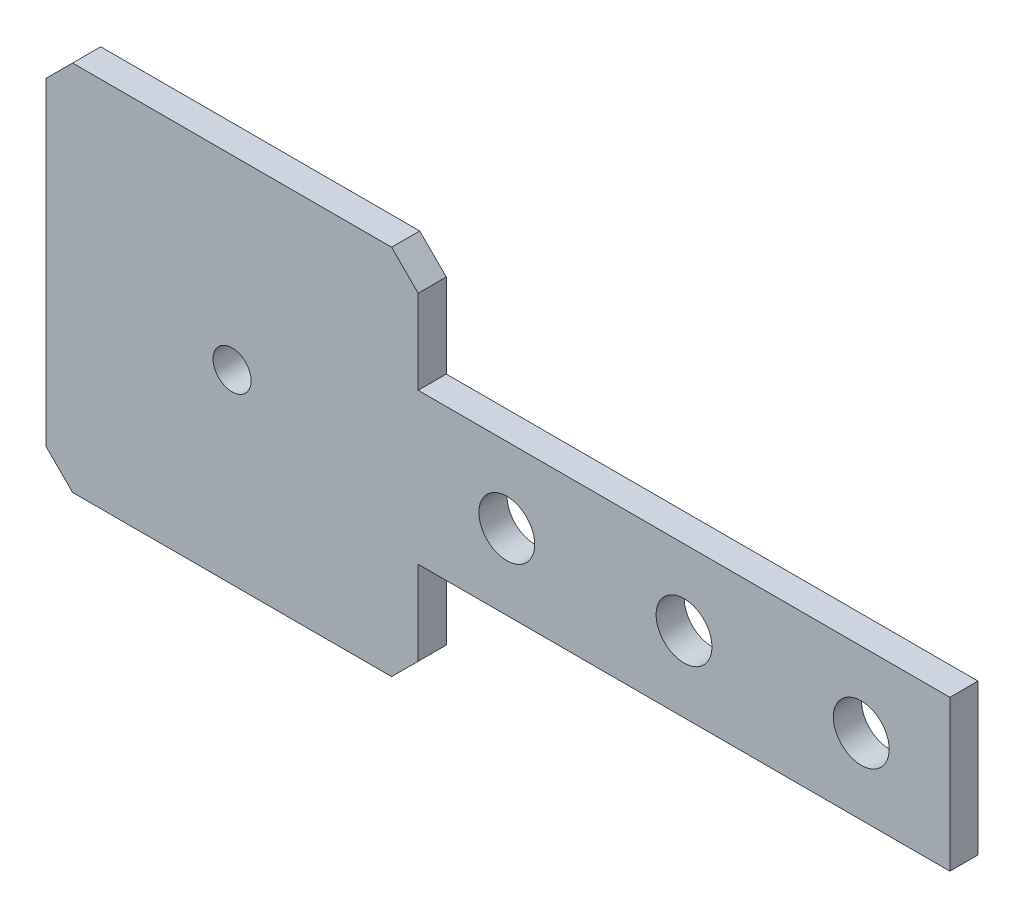
ISO-10303-21;
HEADER;
FILE_DESCRIPTION(('STEP AP214'),'2;1');
FILE_NAME('part.step','',(''),(''),'','','');
FILE_SCHEMA(('AUTOMOTIVE_DESIGN { 1 0 10303 214 1 1 1 1 }'));
ENDSEC;
DATA;
#1=APPLICATION_CONTEXT('core data for automotive mechanical design processes');
#2=APPLICATION_PROTOCOL_DEFINITION('international standard','automotive_design',2000,#1);
#3=PRODUCT_CONTEXT('',#1,'mechanical');
#4=PRODUCT('Part','Part','',(#3));
#5=PRODUCT_RELATED_PRODUCT_CATEGORY('part','',(#4));
#6=PRODUCT_DEFINITION_FORMATION('','',#4);
#7=PRODUCT_DEFINITION_CONTEXT('part definition',#1,'design');
#8=PRODUCT_DEFINITION('design','',#6,#7);
#9=PRODUCT_DEFINITION_SHAPE('','',#8);
#10=(LENGTH_UNIT() NAMED_UNIT(*) SI_UNIT(.MILLI.,.METRE.));
#11=(NAMED_UNIT(*) PLANE_ANGLE_UNIT() SI_UNIT($,.RADIAN.));
#12=(NAMED_UNIT(*) SI_UNIT($,.STERADIAN.) SOLID_ANGLE_UNIT());
#13=UNCERTAINTY_MEASURE_WITH_UNIT(LENGTH_MEASURE(1.E-05),#10,'distance_accuracy_value','');
#14=(GEOMETRIC_REPRESENTATION_CONTEXT(3) GLOBAL_UNCERTAINTY_ASSIGNED_CONTEXT((#13)) GLOBAL_UNIT_ASSIGNED_CONTEXT((#10,
#11,#12)) REPRESENTATION_CONTEXT('',''));
#15=CARTESIAN_POINT('',(0.,0.,0.));
#16=DIRECTION('',(0.,0.,1.));
#17=DIRECTION('',(1.,0.,0.));
#18=AXIS2_PLACEMENT_3D('',#15,#16,#17);
#19=CARTESIAN_POINT('',(0.,0.,3.17500000000004));
#20=DIRECTION('',(0.,0.,1.));
#21=DIRECTION('',(0.999999999999999,0.,0.));
#22=AXIS2_PLACEMENT_3D('',#19,#20,#21);
#23=PLANE('',#22);
#24=CARTESIAN_POINT('',(-80.0695335083055,-33.0925557638442,3.17500000000004));
#25=DIRECTION('',(0.,0.,1.));
#26=DIRECTION('',(0.999999999999999,0.,0.));
#27=AXIS2_PLACEMENT_3D('',#24,#25,#26);
#28=CIRCLE('',#27,3.15);
#29=CARTESIAN_POINT('',(-76.9195335083055,-33.0925557638442,3.17500000000004));
#30=VERTEX_POINT('',#29);
#31=EDGE_CURVE('E343',#30,#30,#28,.T.);
#32=ORIENTED_EDGE('',*,*,#31,.F.);
#33=EDGE_LOOP('',(#32));
#34=FACE_BOUND('',#33,.T.);
#35=CARTESIAN_POINT('',(-111.069533508305,-33.0925557638438,3.17500000000004));
#36=DIRECTION('',(0.,0.,1.));
#37=DIRECTION('',(0.999999999999999,0.,0.));
#38=AXIS2_PLACEMENT_3D('',#35,#36,#37);
#39=CIRCLE('',#38,2.15);
#40=CARTESIAN_POINT('',(-108.919533508305,-33.0925557638438,3.17500000000004));
#41=VERTEX_POINT('',#40);
#42=EDGE_CURVE('E173',#41,#41,#39,.T.);
#43=ORIENTED_EDGE('',*,*,#42,.F.);
#44=EDGE_LOOP('',(#43));
#45=FACE_BOUND('',#44,.T.);
#46=DIRECTION('',(0.707106781186554,0.707106781186541,0.));
#47=VECTOR('',#46,1.);
#48=CARTESIAN_POINT('',(-93.0695335083056,-54.0770792256711,3.17499999999993));
#49=LINE('',#48,#47);
#50=CARTESIAN_POINT('',(-93.0695335083056,-54.0770792256711,3.17499999999993));
#51=VERTEX_POINT('',#50);
#52=CARTESIAN_POINT('',(-90.0695335083055,-51.0770792256709,3.17499999999993));
#53=VERTEX_POINT('',#52);
#54=EDGE_CURVE('E203',#51,#53,#49,.T.);
#55=ORIENTED_EDGE('',*,*,#54,.T.);
#56=DIRECTION('',(0.,1.,0.));
#57=VECTOR('',#56,1.);
#58=CARTESIAN_POINT('',(-90.0695335083055,-51.0770792256709,3.17499999999993));
#59=LINE('',#58,#57);
#60=CARTESIAN_POINT('',(-90.0695335083055,-41.5925557638441,3.17500000000004));
#61=VERTEX_POINT('',#60);
#62=EDGE_CURVE('E114',#53,#61,#59,.T.);
#63=ORIENTED_EDGE('',*,*,#62,.T.);
#64=DIRECTION('',(0.999999999999999,0.,0.));
#65=VECTOR('',#64,1.);
#66=CARTESIAN_POINT('',(-90.0695335083055,-41.5925557638441,3.17500000000004));
#67=LINE('',#66,#65);
#68=CARTESIAN_POINT('',(-30.0695335083057,-41.5925557638441,3.17500000000004));
#69=VERTEX_POINT('',#68);
#70=EDGE_CURVE('E241',#61,#69,#67,.T.);
#71=ORIENTED_EDGE('',*,*,#70,.T.);
#72=DIRECTION('',(0.,1.,0.));
#73=VECTOR('',#72,1.);
#74=CARTESIAN_POINT('',(-30.0695335083057,-41.5925557638441,3.17500000000004));
#75=LINE('',#74,#73);
#76=CARTESIAN_POINT('',(-30.0695335083054,-24.5925557638442,3.17499999999915));
#77=VERTEX_POINT('',#76);
#78=EDGE_CURVE('E261',#69,#77,#75,.T.);
#79=ORIENTED_EDGE('',*,*,#78,.T.);
#80=DIRECTION('',(-0.999999999999999,0.,0.));
#81=VECTOR('',#80,1.);
#82=CARTESIAN_POINT('',(-30.0695335083054,-24.5925557638442,3.17499999999915));
#83=LINE('',#82,#81);
#84=CARTESIAN_POINT('',(-90.0695335083055,-24.5925557638442,3.17499999999915));
#85=VERTEX_POINT('',#84);
#86=EDGE_CURVE('E257',#77,#85,#83,.T.);
#87=ORIENTED_EDGE('',*,*,#86,.T.);
#88=DIRECTION('',(0.,1.,0.));
#89=VECTOR('',#88,1.);
#90=CARTESIAN_POINT('',(-90.0695335083055,-24.5925557638442,3.17499999999915));
#91=LINE('',#90,#89);
#92=CARTESIAN_POINT('',(-90.0695335083048,-15.1080323020174,3.17499999999993));
#93=VERTEX_POINT('',#92);
#94=EDGE_CURVE('E260',#85,#93,#91,.T.);
#95=ORIENTED_EDGE('',*,*,#94,.T.);
#96=DIRECTION('',(-0.707106781186548,0.707106781186547,0.));
#97=VECTOR('',#96,1.);
#98=CARTESIAN_POINT('',(-90.0695335083048,-15.1080323020174,3.17499999999993));
#99=LINE('',#98,#97);
#100=CARTESIAN_POINT('',(-93.0695335083049,-12.1080323020173,3.17499999999993));
#101=VERTEX_POINT('',#100);
#102=EDGE_CURVE('E266',#93,#101,#99,.T.);
#103=ORIENTED_EDGE('',*,*,#102,.T.);
#104=DIRECTION('',(-0.999999999999999,0.,0.));
#105=VECTOR('',#104,1.);
#106=CARTESIAN_POINT('',(-93.0695335083049,-12.1080323020173,3.17499999999993));
#107=LINE('',#106,#105);
#108=CARTESIAN_POINT('',(-129.069533508305,-12.1080323020184,3.17499999999993));
#109=VERTEX_POINT('',#108);
#110=EDGE_CURVE('E273',#101,#109,#107,.T.);
#111=ORIENTED_EDGE('',*,*,#110,.T.);
#112=DIRECTION('',(-0.707106781186548,-0.707106781186547,0.));
#113=VECTOR('',#112,1.);
#114=CARTESIAN_POINT('',(-129.069533508305,-12.1080323020184,3.17499999999993));
#115=LINE('',#114,#113);
#116=CARTESIAN_POINT('',(-132.069533508305,-15.108032302018,3.17499999999993));
#117=VERTEX_POINT('',#116);
#118=EDGE_CURVE('E145',#109,#117,#115,.T.);
#119=ORIENTED_EDGE('',*,*,#118,.T.);
#120=DIRECTION('',(0.,-1.,0.));
#121=VECTOR('',#120,1.);
#122=CARTESIAN_POINT('',(-132.069533508305,-15.108032302018,3.17499999999993));
#123=LINE('',#122,#121);
#124=CARTESIAN_POINT('',(-132.069533508306,-51.0770792256717,3.17499999999993));
#125=VERTEX_POINT('',#124);
#126=EDGE_CURVE('E139',#117,#125,#123,.T.);
#127=ORIENTED_EDGE('',*,*,#126,.T.);
#128=DIRECTION('',(0.707106781186548,-0.707106781186547,0.));
#129=VECTOR('',#128,1.);
#130=CARTESIAN_POINT('',(-132.069533508306,-51.0770792256717,3.17499999999993));
#131=LINE('',#130,#129);
#132=CARTESIAN_POINT('',(-129.069533508305,-54.077079225672,3.17499999999993));
#133=VERTEX_POINT('',#132);
#134=EDGE_CURVE('E143',#125,#133,#131,.T.);
#135=ORIENTED_EDGE('',*,*,#134,.T.);
#136=DIRECTION('',(0.999999999999999,0.,0.));
#137=VECTOR('',#136,1.);
#138=CARTESIAN_POINT('',(-129.069533508305,-54.077079225672,3.17499999999993));
#139=LINE('',#138,#137);
#140=EDGE_CURVE('E59',#133,#51,#139,.T.);
#141=ORIENTED_EDGE('',*,*,#140,.T.);
#142=EDGE_LOOP('',(#55,#63,#71,#79,#87,#95,#103,#111,#119,#127,#135,#141));
#143=FACE_BOUND('',#142,.T.);
#144=CARTESIAN_POINT('',(-60.0695335083055,-33.0925557638438,3.17500000000004));
#145=DIRECTION('',(0.,0.,1.));
#146=DIRECTION('',(0.999999999999999,0.,0.));
#147=AXIS2_PLACEMENT_3D('',#144,#145,#146);
#148=CIRCLE('',#147,3.15);
#149=CARTESIAN_POINT('',(-56.9195335083055,-33.0925557638438,3.17500000000004));
#150=VERTEX_POINT('',#149);
#151=EDGE_CURVE('E351',#150,#150,#148,.T.);
#152=ORIENTED_EDGE('',*,*,#151,.F.);
#153=EDGE_LOOP('',(#152));
#154=FACE_BOUND('',#153,.T.);
#155=CARTESIAN_POINT('',(-40.0695335083054,-33.0925557638438,3.17500000000004));
#156=DIRECTION('',(0.,0.,1.));
#157=DIRECTION('',(0.999999999999999,0.,0.));
#158=AXIS2_PLACEMENT_3D('',#155,#156,#157);
#159=CIRCLE('',#158,3.15);
#160=CARTESIAN_POINT('',(-36.9195335083054,-33.0925557638438,3.17500000000004));
#161=VERTEX_POINT('',#160);
#162=EDGE_CURVE('E331',#161,#161,#159,.T.);
#163=ORIENTED_EDGE('',*,*,#162,.F.);
#164=EDGE_LOOP('',(#163));
#165=FACE_BOUND('',#164,.T.);
#166=ADVANCED_FACE('F41',(#34,#45,#143,#154,#165),#23,.T.);
#167=CARTESIAN_POINT('',(0.,0.,0.));
#168=DIRECTION('',(0.,0.,1.));
#169=DIRECTION('',(0.999999999999999,0.,0.));
#170=AXIS2_PLACEMENT_3D('',#167,#168,#169);
#171=PLANE('',#170);
#172=DIRECTION('',(0.707106781186554,0.707106781186541,0.));
#173=VECTOR('',#172,1.);
#174=CARTESIAN_POINT('',(-93.0695335083056,-54.0770792256711,0.));
#175=LINE('',#174,#173);
#176=CARTESIAN_POINT('',(-93.0695335083056,-54.0770792256711,0.));
#177=VERTEX_POINT('',#176);
#178=CARTESIAN_POINT('',(-90.0695335083055,-51.0770792256709,0.));
#179=VERTEX_POINT('',#178);
#180=EDGE_CURVE('E168',#177,#179,#175,.T.);
#181=ORIENTED_EDGE('',*,*,#180,.F.);
#182=DIRECTION('',(0.999999999999999,0.,0.));
#183=VECTOR('',#182,1.);
#184=CARTESIAN_POINT('',(-129.069533508305,-54.077079225672,0.));
#185=LINE('',#184,#183);
#186=CARTESIAN_POINT('',(-129.069533508305,-54.077079225672,0.));
#187=VERTEX_POINT('',#186);
#188=EDGE_CURVE('E106',#187,#177,#185,.T.);
#189=ORIENTED_EDGE('',*,*,#188,.F.);
#190=DIRECTION('',(0.707106781186548,-0.707106781186547,0.));
#191=VECTOR('',#190,1.);
#192=CARTESIAN_POINT('',(-132.069533508306,-51.0770792256717,0.));
#193=LINE('',#192,#191);
#194=CARTESIAN_POINT('',(-132.069533508306,-51.0770792256717,0.));
#195=VERTEX_POINT('',#194);
#196=EDGE_CURVE('E100',#195,#187,#193,.T.);
#197=ORIENTED_EDGE('',*,*,#196,.F.);
#198=DIRECTION('',(0.,-1.,0.));
#199=VECTOR('',#198,1.);
#200=CARTESIAN_POINT('',(-132.069533508305,-15.108032302018,0.));
#201=LINE('',#200,#199);
#202=CARTESIAN_POINT('',(-132.069533508305,-15.108032302018,0.));
#203=VERTEX_POINT('',#202);
#204=EDGE_CURVE('E154',#203,#195,#201,.T.);
#205=ORIENTED_EDGE('',*,*,#204,.F.);
#206=DIRECTION('',(-0.707106781186548,-0.707106781186547,0.));
#207=VECTOR('',#206,1.);
#208=CARTESIAN_POINT('',(-129.069533508305,-12.1080323020184,0.));
#209=LINE('',#208,#207);
#210=CARTESIAN_POINT('',(-129.069533508305,-12.1080323020184,0.));
#211=VERTEX_POINT('',#210);
#212=EDGE_CURVE('E194',#211,#203,#209,.T.);
#213=ORIENTED_EDGE('',*,*,#212,.F.);
#214=DIRECTION('',(-0.999999999999999,0.,0.));
#215=VECTOR('',#214,1.);
#216=CARTESIAN_POINT('',(-93.0695335083049,-12.1080323020173,0.));
#217=LINE('',#216,#215);
#218=CARTESIAN_POINT('',(-93.0695335083049,-12.1080323020173,0.));
#219=VERTEX_POINT('',#218);
#220=EDGE_CURVE('E191',#219,#211,#217,.T.);
#221=ORIENTED_EDGE('',*,*,#220,.F.);
#222=DIRECTION('',(-0.707106781186548,0.707106781186547,0.));
#223=VECTOR('',#222,1.);
#224=CARTESIAN_POINT('',(-90.0695335083048,-15.1080323020174,0.));
#225=LINE('',#224,#223);
#226=CARTESIAN_POINT('',(-90.0695335083048,-15.1080323020174,0.));
#227=VERTEX_POINT('',#226);
#228=EDGE_CURVE('E188',#227,#219,#225,.T.);
#229=ORIENTED_EDGE('',*,*,#228,.F.);
#230=DIRECTION('',(0.,1.,0.));
#231=VECTOR('',#230,1.);
#232=CARTESIAN_POINT('',(-90.0695335083055,-24.5925557638442,-8.88178419700125E-13));
#233=LINE('',#232,#231);
#234=CARTESIAN_POINT('',(-90.0695335083055,-24.5925557638442,-8.88178419700125E-13));
#235=VERTEX_POINT('',#234);
#236=EDGE_CURVE('E185',#235,#227,#233,.T.);
#237=ORIENTED_EDGE('',*,*,#236,.F.);
#238=DIRECTION('',(-0.999999999999999,0.,0.));
#239=VECTOR('',#238,1.);
#240=CARTESIAN_POINT('',(-30.0695335083054,-24.5925557638442,-8.88178419700125E-13));
#241=LINE('',#240,#239);
#242=CARTESIAN_POINT('',(-30.0695335083054,-24.5925557638442,-8.88178419700125E-13));
#243=VERTEX_POINT('',#242);
#244=EDGE_CURVE('E182',#243,#235,#241,.T.);
#245=ORIENTED_EDGE('',*,*,#244,.F.);
#246=DIRECTION('',(0.,1.,0.));
#247=VECTOR('',#246,1.);
#248=CARTESIAN_POINT('',(-30.0695335083057,-41.5925557638441,0.));
#249=LINE('',#248,#247);
#250=CARTESIAN_POINT('',(-30.0695335083057,-41.5925557638441,0.));
#251=VERTEX_POINT('',#250);
#252=EDGE_CURVE('E179',#251,#243,#249,.T.);
#253=ORIENTED_EDGE('',*,*,#252,.F.);
#254=DIRECTION('',(0.999999999999999,0.,0.));
#255=VECTOR('',#254,1.);
#256=CARTESIAN_POINT('',(-90.0695335083055,-41.5925557638441,0.));
#257=LINE('',#256,#255);
#258=CARTESIAN_POINT('',(-90.0695335083055,-41.5925557638441,0.));
#259=VERTEX_POINT('',#258);
#260=EDGE_CURVE('E176',#259,#251,#257,.T.);
#261=ORIENTED_EDGE('',*,*,#260,.F.);
#262=DIRECTION('',(0.,1.,0.));
#263=VECTOR('',#262,1.);
#264=CARTESIAN_POINT('',(-90.0695335083055,-51.0770792256709,0.));
#265=LINE('',#264,#263);
#266=EDGE_CURVE('E172',#179,#259,#265,.T.);
#267=ORIENTED_EDGE('',*,*,#266,.F.);
#268=EDGE_LOOP('',(#181,#189,#197,#205,#213,#221,#229,#237,#245,#253,#261,#267));
#269=FACE_BOUND('',#268,.T.);
#270=CARTESIAN_POINT('',(-111.069533508305,-33.0925557638438,0.));
#271=DIRECTION('',(0.,0.,1.));
#272=DIRECTION('',(0.999999999999999,0.,0.));
#273=AXIS2_PLACEMENT_3D('',#270,#271,#272);
#274=CIRCLE('',#273,2.15);
#275=CARTESIAN_POINT('',(-108.919533508305,-33.0925557638438,0.));
#276=VERTEX_POINT('',#275);
#277=EDGE_CURVE('E355',#276,#276,#274,.T.);
#278=ORIENTED_EDGE('',*,*,#277,.T.);
#279=EDGE_LOOP('',(#278));
#280=FACE_BOUND('',#279,.T.);
#281=CARTESIAN_POINT('',(-60.0695335083055,-33.0925557638438,0.));
#282=DIRECTION('',(0.,0.,1.));
#283=DIRECTION('',(0.999999999999999,0.,0.));
#284=AXIS2_PLACEMENT_3D('',#281,#282,#283);
#285=CIRCLE('',#284,3.15);
#286=CARTESIAN_POINT('',(-56.9195335083055,-33.0925557638438,0.));
#287=VERTEX_POINT('',#286);
#288=EDGE_CURVE('E347',#287,#287,#285,.T.);
#289=ORIENTED_EDGE('',*,*,#288,.T.);
#290=EDGE_LOOP('',(#289));
#291=FACE_BOUND('',#290,.T.);
#292=CARTESIAN_POINT('',(-80.0695335083055,-33.0925557638442,0.));
#293=DIRECTION('',(0.,0.,1.));
#294=DIRECTION('',(0.999999999999999,0.,0.));
#295=AXIS2_PLACEMENT_3D('',#292,#293,#294);
#296=CIRCLE('',#295,3.15);
#297=CARTESIAN_POINT('',(-76.9195335083055,-33.0925557638442,0.));
#298=VERTEX_POINT('',#297);
#299=EDGE_CURVE('E340',#298,#298,#296,.T.);
#300=ORIENTED_EDGE('',*,*,#299,.T.);
#301=EDGE_LOOP('',(#300));
#302=FACE_BOUND('',#301,.T.);
#303=CARTESIAN_POINT('',(-40.0695335083054,-33.0925557638438,0.));
#304=DIRECTION('',(0.,0.,1.));
#305=DIRECTION('',(0.999999999999999,0.,0.));
#306=AXIS2_PLACEMENT_3D('',#303,#304,#305);
#307=CIRCLE('',#306,3.15);
#308=CARTESIAN_POINT('',(-36.9195335083054,-33.0925557638438,0.));
#309=VERTEX_POINT('',#308);
#310=EDGE_CURVE('E334',#309,#309,#307,.T.);
#311=ORIENTED_EDGE('',*,*,#310,.T.);
#312=EDGE_LOOP('',(#311));
#313=FACE_BOUND('',#312,.T.);
#314=ADVANCED_FACE('F245',(#269,#280,#291,#302,#313),#171,.F.);
#315=CARTESIAN_POINT('',(-93.0695335083056,-54.0770792256711,3.17499999999993));
#316=DIRECTION('',(-0.707106781186539,0.707106781186555,0.));
#317=DIRECTION('',(-0.707106781186554,-0.707106781186541,0.));
#318=AXIS2_PLACEMENT_3D('',#315,#316,#317);
#319=PLANE('',#318);
#320=ORIENTED_EDGE('',*,*,#180,.T.);
#321=DIRECTION('',(0.,0.,-1.));
#322=VECTOR('',#321,1.);
#323=CARTESIAN_POINT('',(-90.0695335083055,-51.0770792256709,3.17499999999993));
#324=LINE('',#323,#322);
#325=EDGE_CURVE('E11',#53,#179,#324,.T.);
#326=ORIENTED_EDGE('',*,*,#325,.F.);
#327=ORIENTED_EDGE('',*,*,#54,.F.);
#328=DIRECTION('',(0.,0.,-1.));
#329=VECTOR('',#328,1.);
#330=CARTESIAN_POINT('',(-93.0695335083056,-54.0770792256711,3.17499999999993));
#331=LINE('',#330,#329);
#332=EDGE_CURVE('E164',#51,#177,#331,.T.);
#333=ORIENTED_EDGE('',*,*,#332,.T.);
#334=EDGE_LOOP('',(#320,#326,#327,#333));
#335=FACE_BOUND('',#334,.T.);
#336=ADVANCED_FACE('F43',(#335),#319,.F.);
#337=CARTESIAN_POINT('',(-90.0695335083055,-51.0770792256709,3.17499999999993));
#338=DIRECTION('',(-0.999999999999999,0.,0.));
#339=DIRECTION('',(0.,0.,1.));
#340=AXIS2_PLACEMENT_3D('',#337,#338,#339);
#341=PLANE('',#340);
#342=ORIENTED_EDGE('',*,*,#266,.T.);
#343=DIRECTION('',(0.,0.,-1.));
#344=VECTOR('',#343,1.);
#345=CARTESIAN_POINT('',(-90.0695335083055,-41.5925557638441,3.17500000000004));
#346=LINE('',#345,#344);
#347=EDGE_CURVE('E51',#61,#259,#346,.T.);
#348=ORIENTED_EDGE('',*,*,#347,.F.);
#349=ORIENTED_EDGE('',*,*,#62,.F.);
#350=ORIENTED_EDGE('',*,*,#325,.T.);
#351=EDGE_LOOP('',(#342,#348,#349,#350));
#352=FACE_BOUND('',#351,.T.);
#353=ADVANCED_FACE('F498',(#352),#341,.F.);
#354=CARTESIAN_POINT('',(-90.0695335083055,-41.5925557638441,3.17500000000004));
#355=DIRECTION('',(0.,1.,0.));
#356=DIRECTION('',(0.,0.,1.));
#357=AXIS2_PLACEMENT_3D('',#354,#355,#356);
#358=PLANE('',#357);
#359=ORIENTED_EDGE('',*,*,#260,.T.);
#360=DIRECTION('',(0.,0.,-1.));
#361=VECTOR('',#360,1.);
#362=CARTESIAN_POINT('',(-30.0695335083057,-41.5925557638441,3.17500000000004));
#363=LINE('',#362,#361);
#364=EDGE_CURVE('E230',#69,#251,#363,.T.);
#365=ORIENTED_EDGE('',*,*,#364,.F.);
#366=ORIENTED_EDGE('',*,*,#70,.F.);
#367=ORIENTED_EDGE('',*,*,#347,.T.);
#368=EDGE_LOOP('',(#359,#365,#366,#367));
#369=FACE_BOUND('',#368,.T.);
#370=ADVANCED_FACE('F239',(#369),#358,.F.);
#371=CARTESIAN_POINT('',(-30.0695335083057,-41.5925557638441,3.17500000000004));
#372=DIRECTION('',(-0.999999999999999,0.,0.));
#373=DIRECTION('',(0.,0.,1.));
#374=AXIS2_PLACEMENT_3D('',#371,#372,#373);
#375=PLANE('',#374);
#376=ORIENTED_EDGE('',*,*,#252,.T.);
#377=DIRECTION('',(0.,0.,-1.));
#378=VECTOR('',#377,1.);
#379=CARTESIAN_POINT('',(-30.0695335083054,-24.5925557638442,3.17499999999915));
#380=LINE('',#379,#378);
#381=EDGE_CURVE('E226',#77,#243,#380,.T.);
#382=ORIENTED_EDGE('',*,*,#381,.F.);
#383=ORIENTED_EDGE('',*,*,#78,.F.);
#384=ORIENTED_EDGE('',*,*,#364,.T.);
#385=EDGE_LOOP('',(#376,#382,#383,#384));
#386=FACE_BOUND('',#385,.T.);
#387=ADVANCED_FACE('F251',(#386),#375,.F.);
#388=CARTESIAN_POINT('',(-30.0695335083054,-24.5925557638442,3.17499999999915));
#389=DIRECTION('',(0.,-1.,0.));
#390=DIRECTION('',(0.,0.,-1.));
#391=AXIS2_PLACEMENT_3D('',#388,#389,#390);
#392=PLANE('',#391);
#393=ORIENTED_EDGE('',*,*,#244,.T.);
#394=DIRECTION('',(0.,0.,-1.));
#395=VECTOR('',#394,1.);
#396=CARTESIAN_POINT('',(-90.0695335083055,-24.5925557638442,3.17499999999915));
#397=LINE('',#396,#395);
#398=EDGE_CURVE('E222',#85,#235,#397,.T.);
#399=ORIENTED_EDGE('',*,*,#398,.F.);
#400=ORIENTED_EDGE('',*,*,#86,.F.);
#401=ORIENTED_EDGE('',*,*,#381,.T.);
#402=EDGE_LOOP('',(#393,#399,#400,#401));
#403=FACE_BOUND('',#402,.T.);
#404=ADVANCED_FACE('F255',(#403),#392,.F.);
#405=CARTESIAN_POINT('',(-90.0695335083055,-24.5925557638442,3.17499999999915));
#406=DIRECTION('',(-0.999999999999999,0.,0.));
#407=DIRECTION('',(0.,-1.,0.));
#408=AXIS2_PLACEMENT_3D('',#405,#406,#407);
#409=PLANE('',#408);
#410=ORIENTED_EDGE('',*,*,#236,.T.);
#411=DIRECTION('',(0.,0.,-1.));
#412=VECTOR('',#411,1.);
#413=CARTESIAN_POINT('',(-90.0695335083048,-15.1080323020174,3.17499999999993));
#414=LINE('',#413,#412);
#415=EDGE_CURVE('E218',#93,#227,#414,.T.);
#416=ORIENTED_EDGE('',*,*,#415,.F.);
#417=ORIENTED_EDGE('',*,*,#94,.F.);
#418=ORIENTED_EDGE('',*,*,#398,.T.);
#419=EDGE_LOOP('',(#410,#416,#417,#418));
#420=FACE_BOUND('',#419,.T.);
#421=ADVANCED_FACE('F463',(#420),#409,.F.);
#422=CARTESIAN_POINT('',(-90.0695335083048,-15.1080323020174,3.17499999999993));
#423=DIRECTION('',(-0.707106781186546,-0.707106781186549,0.));
#424=DIRECTION('',(0.707106781186548,-0.707106781186547,0.));
#425=AXIS2_PLACEMENT_3D('',#422,#423,#424);
#426=PLANE('',#425);
#427=ORIENTED_EDGE('',*,*,#228,.T.);
#428=DIRECTION('',(0.,0.,-1.));
#429=VECTOR('',#428,1.);
#430=CARTESIAN_POINT('',(-93.0695335083049,-12.1080323020173,3.17499999999993));
#431=LINE('',#430,#429);
#432=EDGE_CURVE('E214',#101,#219,#431,.T.);
#433=ORIENTED_EDGE('',*,*,#432,.F.);
#434=ORIENTED_EDGE('',*,*,#102,.F.);
#435=ORIENTED_EDGE('',*,*,#415,.T.);
#436=EDGE_LOOP('',(#427,#433,#434,#435));
#437=FACE_BOUND('',#436,.T.);
#438=ADVANCED_FACE('F454',(#437),#426,.F.);
#439=CARTESIAN_POINT('',(-93.0695335083049,-12.1080323020173,3.17499999999993));
#440=DIRECTION('',(0.,-1.,0.));
#441=DIRECTION('',(0.,0.,-1.));
#442=AXIS2_PLACEMENT_3D('',#439,#440,#441);
#443=PLANE('',#442);
#444=ORIENTED_EDGE('',*,*,#220,.T.);
#445=DIRECTION('',(0.,0.,-1.));
#446=VECTOR('',#445,1.);
#447=CARTESIAN_POINT('',(-129.069533508305,-12.1080323020184,3.17499999999993));
#448=LINE('',#447,#446);
#449=EDGE_CURVE('E210',#109,#211,#448,.T.);
#450=ORIENTED_EDGE('',*,*,#449,.F.);
#451=ORIENTED_EDGE('',*,*,#110,.F.);
#452=ORIENTED_EDGE('',*,*,#432,.T.);
#453=EDGE_LOOP('',(#444,#450,#451,#452));
#454=FACE_BOUND('',#453,.T.);
#455=ADVANCED_FACE('F286',(#454),#443,.F.);
#456=CARTESIAN_POINT('',(-129.069533508305,-12.1080323020184,3.17499999999993));
#457=DIRECTION('',(0.707106781186546,-0.707106781186549,0.));
#458=DIRECTION('',(0.707106781186548,0.707106781186547,0.));
#459=AXIS2_PLACEMENT_3D('',#456,#457,#458);
#460=PLANE('',#459);
#461=ORIENTED_EDGE('',*,*,#212,.T.);
#462=DIRECTION('',(0.,0.,-1.));
#463=VECTOR('',#462,1.);
#464=CARTESIAN_POINT('',(-132.069533508305,-15.108032302018,3.17499999999993));
#465=LINE('',#464,#463);
#466=EDGE_CURVE('E156',#117,#203,#465,.T.);
#467=ORIENTED_EDGE('',*,*,#466,.F.);
#468=ORIENTED_EDGE('',*,*,#118,.F.);
#469=ORIENTED_EDGE('',*,*,#449,.T.);
#470=EDGE_LOOP('',(#461,#467,#468,#469));
#471=FACE_BOUND('',#470,.T.);
#472=ADVANCED_FACE('F290',(#471),#460,.F.);
#473=CARTESIAN_POINT('',(-132.069533508305,-15.108032302018,3.17499999999993));
#474=DIRECTION('',(0.999999999999999,0.,0.));
#475=DIRECTION('',(0.,0.,-1.));
#476=AXIS2_PLACEMENT_3D('',#473,#474,#475);
#477=PLANE('',#476);
#478=ORIENTED_EDGE('',*,*,#204,.T.);
#479=DIRECTION('',(0.,0.,-1.));
#480=VECTOR('',#479,1.);
#481=CARTESIAN_POINT('',(-132.069533508306,-51.0770792256717,3.17499999999993));
#482=LINE('',#481,#480);
#483=EDGE_CURVE('E151',#125,#195,#482,.T.);
#484=ORIENTED_EDGE('',*,*,#483,.F.);
#485=ORIENTED_EDGE('',*,*,#126,.F.);
#486=ORIENTED_EDGE('',*,*,#466,.T.);
#487=EDGE_LOOP('',(#478,#484,#485,#486));
#488=FACE_BOUND('',#487,.T.);
#489=ADVANCED_FACE('F152',(#488),#477,.F.);
#490=CARTESIAN_POINT('',(-132.069533508306,-51.0770792256717,3.17499999999993));
#491=DIRECTION('',(0.707106781186546,0.707106781186549,0.));
#492=DIRECTION('',(-0.707106781186548,0.707106781186547,0.));
#493=AXIS2_PLACEMENT_3D('',#490,#491,#492);
#494=PLANE('',#493);
#495=ORIENTED_EDGE('',*,*,#196,.T.);
#496=DIRECTION('',(0.,0.,-1.));
#497=VECTOR('',#496,1.);
#498=CARTESIAN_POINT('',(-129.069533508305,-54.077079225672,3.17499999999993));
#499=LINE('',#498,#497);
#500=EDGE_CURVE('E157',#133,#187,#499,.T.);
#501=ORIENTED_EDGE('',*,*,#500,.F.);
#502=ORIENTED_EDGE('',*,*,#134,.F.);
#503=ORIENTED_EDGE('',*,*,#483,.T.);
#504=EDGE_LOOP('',(#495,#501,#502,#503));
#505=FACE_BOUND('',#504,.T.);
#506=ADVANCED_FACE('F159',(#505),#494,.F.);
#507=CARTESIAN_POINT('',(-129.069533508305,-54.077079225672,3.17499999999993));
#508=DIRECTION('',(0.,1.,0.));
#509=DIRECTION('',(0.,0.,1.));
#510=AXIS2_PLACEMENT_3D('',#507,#508,#509);
#511=PLANE('',#510);
#512=ORIENTED_EDGE('',*,*,#188,.T.);
#513=ORIENTED_EDGE('',*,*,#332,.F.);
#514=ORIENTED_EDGE('',*,*,#140,.F.);
#515=ORIENTED_EDGE('',*,*,#500,.T.);
#516=EDGE_LOOP('',(#512,#513,#514,#515));
#517=FACE_BOUND('',#516,.T.);
#518=ADVANCED_FACE('F294',(#517),#511,.F.);
#519=CARTESIAN_POINT('',(-111.069533508305,-33.0925557638438,3.17500000000004));
#520=DIRECTION('',(0.,0.,-1.));
#521=DIRECTION('',(-0.999999999999999,0.,0.));
#522=AXIS2_PLACEMENT_3D('',#519,#520,#521);
#523=CYLINDRICAL_SURFACE('',#522,2.15);
#524=ORIENTED_EDGE('',*,*,#42,.T.);
#525=EDGE_LOOP('',(#524));
#526=FACE_BOUND('',#525,.T.);
#527=ORIENTED_EDGE('',*,*,#277,.F.);
#528=EDGE_LOOP('',(#527));
#529=FACE_BOUND('',#528,.T.);
#530=ADVANCED_FACE('F296',(#526,#529),#523,.F.);
#531=CARTESIAN_POINT('',(-60.0695335083055,-33.0925557638438,3.17500000000004));
#532=DIRECTION('',(0.,0.,-1.));
#533=DIRECTION('',(-0.999999999999999,0.,0.));
#534=AXIS2_PLACEMENT_3D('',#531,#532,#533);
#535=CYLINDRICAL_SURFACE('',#534,3.15);
#536=ORIENTED_EDGE('',*,*,#151,.T.);
#537=EDGE_LOOP('',(#536));
#538=FACE_BOUND('',#537,.T.);
#539=ORIENTED_EDGE('',*,*,#288,.F.);
#540=EDGE_LOOP('',(#539));
#541=FACE_BOUND('',#540,.T.);
#542=ADVANCED_FACE('F302',(#538,#541),#535,.F.);
#543=CARTESIAN_POINT('',(-80.0695335083055,-33.0925557638442,3.17500000000004));
#544=DIRECTION('',(0.,0.,-1.));
#545=DIRECTION('',(-0.999999999999999,0.,0.));
#546=AXIS2_PLACEMENT_3D('',#543,#544,#545);
#547=CYLINDRICAL_SURFACE('',#546,3.15);
#548=ORIENTED_EDGE('',*,*,#31,.T.);
#549=EDGE_LOOP('',(#548));
#550=FACE_BOUND('',#549,.T.);
#551=ORIENTED_EDGE('',*,*,#299,.F.);
#552=EDGE_LOOP('',(#551));
#553=FACE_BOUND('',#552,.T.);
#554=ADVANCED_FACE('F318',(#550,#553),#547,.F.);
#555=CARTESIAN_POINT('',(-40.0695335083054,-33.0925557638438,3.17500000000004));
#556=DIRECTION('',(0.,0.,-1.));
#557=DIRECTION('',(-0.999999999999999,0.,0.));
#558=AXIS2_PLACEMENT_3D('',#555,#556,#557);
#559=CYLINDRICAL_SURFACE('',#558,3.15);
#560=ORIENTED_EDGE('',*,*,#162,.T.);
#561=EDGE_LOOP('',(#560));
#562=FACE_BOUND('',#561,.T.);
#563=ORIENTED_EDGE('',*,*,#310,.F.);
#564=EDGE_LOOP('',(#563));
#565=FACE_BOUND('',#564,.T.);
#566=ADVANCED_FACE('F322',(#562,#565),#559,.F.);
#567=CLOSED_SHELL('',(#166,#314,#336,#353,#370,#387,#404,#421,#438,#455,#472,#489,#506,#518,
#530,#542,#554,#566));
#568=MANIFOLD_SOLID_BREP('B2',#567);
#569=ADVANCED_BREP_SHAPE_REPRESENTATION('',(#18,#568),#14);
#570=SHAPE_DEFINITION_REPRESENTATION(#9,#569);
ENDSEC;
END-ISO-10303-21;
